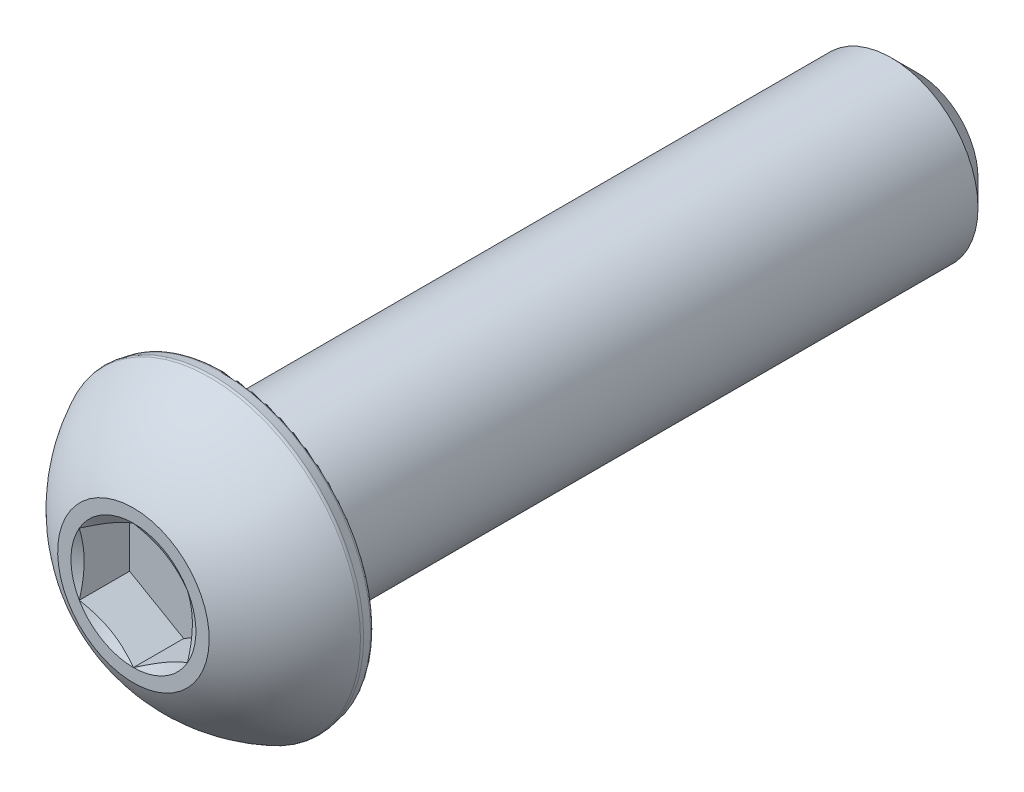
ISO-10303-21;
HEADER;
FILE_DESCRIPTION(('STEP AP214'),'2;1');
FILE_NAME('part.step','',(''),(''),'','','');
FILE_SCHEMA(('AUTOMOTIVE_DESIGN { 1 0 10303 214 1 1 1 1 }'));
ENDSEC;
DATA;
#1=APPLICATION_CONTEXT('core data for automotive mechanical design processes');
#2=APPLICATION_PROTOCOL_DEFINITION('international standard','automotive_design',2000,#1);
#3=PRODUCT_CONTEXT('',#1,'mechanical');
#4=PRODUCT('Part','Part','',(#3));
#5=PRODUCT_RELATED_PRODUCT_CATEGORY('part','',(#4));
#6=PRODUCT_DEFINITION_FORMATION('','',#4);
#7=PRODUCT_DEFINITION_CONTEXT('part definition',#1,'design');
#8=PRODUCT_DEFINITION('design','',#6,#7);
#9=PRODUCT_DEFINITION_SHAPE('','',#8);
#10=(LENGTH_UNIT() NAMED_UNIT(*) SI_UNIT(.MILLI.,.METRE.));
#11=(NAMED_UNIT(*) PLANE_ANGLE_UNIT() SI_UNIT($,.RADIAN.));
#12=(NAMED_UNIT(*) SI_UNIT($,.STERADIAN.) SOLID_ANGLE_UNIT());
#13=UNCERTAINTY_MEASURE_WITH_UNIT(LENGTH_MEASURE(1.E-05),#10,'distance_accuracy_value','');
#14=(GEOMETRIC_REPRESENTATION_CONTEXT(3) GLOBAL_UNCERTAINTY_ASSIGNED_CONTEXT((#13)) GLOBAL_UNIT_ASSIGNED_CONTEXT((#10,
#11,#12)) REPRESENTATION_CONTEXT('',''));
#15=CARTESIAN_POINT('',(0.,0.,0.));
#16=DIRECTION('',(0.,0.,1.));
#17=DIRECTION('',(1.,0.,0.));
#18=AXIS2_PLACEMENT_3D('',#15,#16,#17);
#19=CARTESIAN_POINT('',(0.,0.,14.3764));
#20=DIRECTION('',(0.,0.,-1.));
#21=DIRECTION('',(-1.,0.,0.));
#22=AXIS2_PLACEMENT_3D('',#19,#20,#21);
#23=PLANE('',#22);
#24=CARTESIAN_POINT('',(0.,0.,14.3764));
#25=DIRECTION('',(0.,0.,1.));
#26=DIRECTION('',(1.,0.,0.));
#27=AXIS2_PLACEMENT_3D('',#24,#25,#26);
#28=CIRCLE('',#27,2.29135888084633);
#29=CARTESIAN_POINT('',(-1.984375,1.14567944042316,14.3764));
#30=VERTEX_POINT('',#29);
#31=CARTESIAN_POINT('',(-1.984375,-1.14567944042316,14.3764));
#32=VERTEX_POINT('',#31);
#33=EDGE_CURVE('E87',#30,#32,#28,.T.);
#34=ORIENTED_EDGE('',*,*,#33,.F.);
#35=CARTESIAN_POINT('',(0.,2.29135888084633,14.3764));
#36=VERTEX_POINT('',#35);
#37=EDGE_CURVE('E96',#36,#30,#28,.T.);
#38=ORIENTED_EDGE('',*,*,#37,.F.);
#39=CARTESIAN_POINT('',(1.984375,1.14567944042316,14.3764));
#40=VERTEX_POINT('',#39);
#41=EDGE_CURVE('E47',#40,#36,#28,.T.);
#42=ORIENTED_EDGE('',*,*,#41,.F.);
#43=CARTESIAN_POINT('',(1.984375,-1.14567944042316,14.3764));
#44=VERTEX_POINT('',#43);
#45=EDGE_CURVE('E54',#44,#40,#28,.T.);
#46=ORIENTED_EDGE('',*,*,#45,.F.);
#47=CARTESIAN_POINT('',(0.,-2.29135888084633,14.3764));
#48=VERTEX_POINT('',#47);
#49=EDGE_CURVE('E129',#48,#44,#28,.T.);
#50=ORIENTED_EDGE('',*,*,#49,.F.);
#51=EDGE_CURVE('E97',#32,#48,#28,.T.);
#52=ORIENTED_EDGE('',*,*,#51,.F.);
#53=EDGE_LOOP('',(#34,#38,#42,#46,#50,#52));
#54=FACE_BOUND('',#53,.T.);
#55=CARTESIAN_POINT('',(0.,0.,14.3764));
#56=DIRECTION('',(0.,0.,1.));
#57=DIRECTION('',(1.,0.,0.));
#58=AXIS2_PLACEMENT_3D('',#55,#56,#57);
#59=CIRCLE('',#58,2.778125);
#60=CARTESIAN_POINT('',(0.,2.778125,14.3764));
#61=VERTEX_POINT('',#60);
#62=EDGE_CURVE('E108',#61,#61,#59,.T.);
#63=ORIENTED_EDGE('',*,*,#62,.T.);
#64=EDGE_LOOP('',(#63));
#65=FACE_BOUND('',#64,.T.);
#66=ADVANCED_FACE('F33',(#54,#65),#23,.F.);
#67=CARTESIAN_POINT('',(0.,0.,8.90156816343582));
#68=DIRECTION('',(0.,0.,1.));
#69=DIRECTION('',(0.,1.,0.));
#70=AXIS2_PLACEMENT_3D('',#67,#68,#69);
#71=SPHERICAL_SURFACE('',#70,6.13936170577054);
#72=CARTESIAN_POINT('',(0.,0.,11.5756987678523));
#73=DIRECTION('',(0.,0.,-1.));
#74=DIRECTION('',(-1.,0.,0.));
#75=AXIS2_PLACEMENT_3D('',#72,#73,#74);
#76=CIRCLE('',#75,5.52637201650459);
#77=CARTESIAN_POINT('',(0.,5.52637201650459,11.5756987678523));
#78=VERTEX_POINT('',#77);
#79=EDGE_CURVE('E107',#78,#78,#76,.F.);
#80=CARTESIAN_POINT('',(0.,5.52637201650459,11.5756987678523));
#81=CARTESIAN_POINT('',(0.,5.50825080177499,11.6131483071822));
#82=CARTESIAN_POINT('',(0.,5.48974881162674,11.6504135924003));
#83=CARTESIAN_POINT('',(0.,5.45199117255904,11.7245603788753));
#84=CARTESIAN_POINT('',(0.,5.4327355236396,11.7614418801323));
#85=CARTESIAN_POINT('',(0.,5.39347845909561,11.8348058229478));
#86=CARTESIAN_POINT('',(0.,5.37347704347106,11.8712882645063));
#87=CARTESIAN_POINT('',(0.,5.33273672924781,11.9438390196083));
#88=CARTESIAN_POINT('',(0.,5.3119978306491,11.9799073331517));
#89=CARTESIAN_POINT('',(0.,5.26979111662967,12.051614923668));
#90=CARTESIAN_POINT('',(0.,5.24832330120893,12.087254200641));
#91=CARTESIAN_POINT('',(0.,5.20466762693299,12.1580889898225));
#92=CARTESIAN_POINT('',(0.,5.18247976807778,12.1932845020311));
#93=CARTESIAN_POINT('',(0.,5.13739317629117,12.2632172160699));
#94=CARTESIAN_POINT('',(0.,5.11449444335977,12.2979544178999));
#95=CARTESIAN_POINT('',(0.,5.06799556699608,12.3669561551948));
#96=CARTESIAN_POINT('',(0.,5.04439542356379,12.4012206906595));
#97=CARTESIAN_POINT('',(0.,4.9965034795341,12.4692629345196));
#98=CARTESIAN_POINT('',(0.,4.9722116789367,12.503040642915));
#99=CARTESIAN_POINT('',(0.,4.92294645978839,12.5700952731416));
#100=CARTESIAN_POINT('',(0.,4.89797304123748,12.6033721949729));
#101=CARTESIAN_POINT('',(0.,4.84735490708144,12.6694114995354));
#102=CARTESIAN_POINT('',(0.,4.82171019147632,12.7021738822665));
#103=CARTESIAN_POINT('',(0.,4.76976006154396,12.7671705687402));
#104=CARTESIAN_POINT('',(0.,4.74345464721672,12.7994048724826));
#105=CARTESIAN_POINT('',(0.,4.69019399122224,12.8633320793321));
#106=CARTESIAN_POINT('',(0.,4.66323874955498,12.8950249824391));
#107=CARTESIAN_POINT('',(0.,4.6086895788204,12.9578562901185));
#108=CARTESIAN_POINT('',(0.,4.58109564975306,12.988994694691));
#109=CARTESIAN_POINT('',(0.,4.52528050811203,13.0507041365628));
#110=CARTESIAN_POINT('',(0.,4.49705929553834,13.0812751738621));
#111=CARTESIAN_POINT('',(0.,4.44000125001922,13.1418372469284));
#112=CARTESIAN_POINT('',(0.,4.41116441707379,13.1718282826952));
#113=CARTESIAN_POINT('',(0.,4.35288704836658,13.2312179581372));
#114=CARTESIAN_POINT('',(0.,4.32344651260481,13.2606165978123));
#115=CARTESIAN_POINT('',(0.,4.2639739053159,13.3188093313346));
#116=CARTESIAN_POINT('',(0.,4.23394183378876,13.3476034251818));
#117=CARTESIAN_POINT('',(0.,4.17329856648729,13.4045751671557));
#118=CARTESIAN_POINT('',(0.,4.14268737071296,13.4327528152824));
#119=CARTESIAN_POINT('',(0.,4.08089850577313,13.488480020685));
#120=CARTESIAN_POINT('',(0.,4.04972083660764,13.5160295779609));
#121=CARTESIAN_POINT('',(0.,3.98681190985103,13.5704892161058));
#122=CARTESIAN_POINT('',(0.,3.95508065225992,13.5973992969748));
#123=CARTESIAN_POINT('',(0.,3.89107766240224,13.65056886103));
#124=CARTESIAN_POINT('',(0.,3.85880593013567,13.6768283442161));
#125=CARTESIAN_POINT('',(0.,3.79373532804181,13.7286858605052));
#126=CARTESIAN_POINT('',(0.,3.76093645821454,13.7542838936082));
#127=CARTESIAN_POINT('',(0.,3.69482513596822,13.8048079306936));
#128=CARTESIAN_POINT('',(0.,3.66151268354918,13.829733934676));
#129=CARTESIAN_POINT('',(0.,3.59438796333499,13.8789036122083));
#130=CARTESIAN_POINT('',(0.,3.56057569553984,13.9031472857581));
#131=CARTESIAN_POINT('',(0.,3.49246531836684,13.9509422831338));
#132=CARTESIAN_POINT('',(0.,3.45816720898899,13.9744936069597));
#133=CARTESIAN_POINT('',(0.,3.3890993231695,14.0208941716134));
#134=CARTESIAN_POINT('',(0.,3.35432954672787,14.0437434124411));
#135=CARTESIAN_POINT('',(0.,3.28433269645534,14.088730368404));
#136=CARTESIAN_POINT('',(0.,3.24910562262445,14.1108680835392));
#137=CARTESIAN_POINT('',(0.,3.17820873538992,14.1544228378885));
#138=CARTESIAN_POINT('',(0.,3.14253892198628,14.1758398771027));
#139=CARTESIAN_POINT('',(0.,3.0707712995602,14.2179444331528));
#140=CARTESIAN_POINT('',(0.,3.03467349053775,14.2386319499888));
#141=CARTESIAN_POINT('',(0.,2.96206478589977,14.2792688941756));
#142=CARTESIAN_POINT('',(0.,2.92555389028424,14.2992183215265));
#143=CARTESIAN_POINT('',(0.,2.85213413627351,14.3383709073101));
#144=CARTESIAN_POINT('',(0.,2.81522527787832,14.3575740657429));
#145=CARTESIAN_POINT('',(0.,2.778125,14.3764));
#146=B_SPLINE_CURVE_WITH_KNOTS('',3,(#80,#81,#82,#83,#84,#85,#86,#87,#88,#89,#90,#91,#92,#93,
#94,#95,#96,#97,#98,#99,#100,#101,#102,#103,#104,#105,#106,#107,#108,#109,#110,#111,#112,#113,
#114,#115,#116,#117,#118,#119,#120,#121,#122,#123,#124,#125,#126,#127,#128,#129,#130,#131,#132,
#133,#134,#135,#136,#137,#138,#139,#140,#141,#142,#143,#144,#145),.UNSPECIFIED.,.F.,.F.,(4,2,2,
2,2,2,2,2,2,2,2,2,2,2,2,2,2,2,2,2,2,2,2,2,2,2,2,2,2,2,2,2,4),(0.,0.124808174209303,
0.249616348418608,0.374424522627913,0.499232696837218,0.624040871046522,0.748849045255826,
0.87365721946513,0.998465393674434,1.12327356788374,1.24808174209304,1.37288991630235,
1.49769809051165,1.62250626472096,1.74731443893026,1.87212261313957,1.99693078734887,
2.12173896155817,2.24654713576748,2.37135530997678,2.49616348418609,2.62097165839539,
2.7457798326047,2.870588006814,2.99539618102331,3.12020435523261,3.24501252944191,
3.36982070365122,3.49462887786052,3.61943705206983,3.74424522627913,3.86905340048844,
3.99386157469774),.UNSPECIFIED.);
#147=EDGE_CURVE('BSEAM202',#78,#61,#146,.T.);
#148=ORIENTED_EDGE('',*,*,#79,.T.);
#149=ORIENTED_EDGE('',*,*,#62,.F.);
#150=ORIENTED_EDGE('',*,*,#147,.T.);
#151=ORIENTED_EDGE('',*,*,#147,.F.);
#152=EDGE_LOOP('',(#148,#150,#149,#151));
#153=FACE_BOUND('',#152,.T.);
#154=ADVANCED_FACE('F202',(#153),#71,.T.);
#155=CARTESIAN_POINT('',(0.,0.,11.0236));
#156=DIRECTION('',(0.,0.,1.));
#157=DIRECTION('',(1.,0.,0.));
#158=AXIS2_PLACEMENT_3D('',#155,#156,#157);
#159=CONICAL_SURFACE('',#158,5.4612216348621,0.174532925199434);
#160=CARTESIAN_POINT('',(0.,0.,11.4735691915411));
#161=DIRECTION('',(0.,0.,-1.));
#162=DIRECTION('',(-1.,0.,0.));
#163=AXIS2_PLACEMENT_3D('',#160,#161,#162);
#164=CIRCLE('',#163,5.54056334381837);
#165=CARTESIAN_POINT('',(-5.54056334381837,0.,11.4735691915411));
#166=VERTEX_POINT('',#165);
#167=EDGE_CURVE('E41',#166,#166,#164,.T.);
#168=ORIENTED_EDGE('',*,*,#167,.T.);
#169=EDGE_LOOP('',(#168));
#170=FACE_BOUND('',#169,.T.);
#171=CARTESIAN_POINT('',(0.,0.,11.1621296194959));
#172=DIRECTION('',(0.,0.,-1.));
#173=DIRECTION('',(-1.,0.,0.));
#174=AXIS2_PLACEMENT_3D('',#171,#172,#173);
#175=CIRCLE('',#174,5.48564814440651);
#176=CARTESIAN_POINT('',(-5.48564814440651,0.,11.1621296194959));
#177=VERTEX_POINT('',#176);
#178=EDGE_CURVE('E224',#177,#177,#175,.F.);
#179=ORIENTED_EDGE('',*,*,#178,.T.);
#180=EDGE_LOOP('',(#179));
#181=FACE_BOUND('',#180,.T.);
#182=ADVANCED_FACE('F207',(#170,#181),#159,.T.);
#183=CARTESIAN_POINT('',(0.,5.4612216348621,11.0236));
#184=DIRECTION('',(0.,0.,1.));
#185=DIRECTION('',(1.,0.,0.));
#186=AXIS2_PLACEMENT_3D('',#183,#184,#185);
#187=PLANE('',#186);
#188=CARTESIAN_POINT('',(0.,0.,11.0236));
#189=DIRECTION('',(0.,0.,1.));
#190=DIRECTION('',(1.,0.,0.));
#191=AXIS2_PLACEMENT_3D('',#188,#189,#190);
#192=CIRCLE('',#191,5.32055497269154);
#193=CARTESIAN_POINT('',(5.32055497269154,0.,11.0236));
#194=VERTEX_POINT('',#193);
#195=EDGE_CURVE('E11',#194,#194,#192,.F.);
#196=ORIENTED_EDGE('',*,*,#195,.T.);
#197=EDGE_LOOP('',(#196));
#198=FACE_BOUND('',#197,.T.);
#199=CARTESIAN_POINT('',(0.,0.,11.0236));
#200=DIRECTION('',(0.,0.,1.));
#201=DIRECTION('',(1.,0.,0.));
#202=AXIS2_PLACEMENT_3D('',#199,#200,#201);
#203=CIRCLE('',#202,3.175);
#204=CARTESIAN_POINT('',(3.175,0.,11.0236));
#205=VERTEX_POINT('',#204);
#206=EDGE_CURVE('E289',#205,#205,#203,.T.);
#207=ORIENTED_EDGE('',*,*,#206,.T.);
#208=EDGE_LOOP('',(#207));
#209=FACE_BOUND('',#208,.T.);
#210=ADVANCED_FACE('F230',(#198,#209),#187,.F.);
#211=CARTESIAN_POINT('',(0.,0.,14.3764));
#212=DIRECTION('',(0.,0.,1.));
#213=DIRECTION('',(1.,0.,0.));
#214=AXIS2_PLACEMENT_3D('',#211,#212,#213);
#215=CYLINDRICAL_SURFACE('',#214,3.175);
#216=ORIENTED_EDGE('',*,*,#206,.F.);
#217=EDGE_LOOP('',(#216));
#218=FACE_BOUND('',#217,.T.);
#219=CARTESIAN_POINT('',(0.,0.,-13.4239));
#220=DIRECTION('',(0.,0.,1.));
#221=DIRECTION('',(1.,0.,0.));
#222=AXIS2_PLACEMENT_3D('',#219,#220,#221);
#223=CIRCLE('',#222,3.175);
#224=CARTESIAN_POINT('',(3.175,0.,-13.4239));
#225=VERTEX_POINT('',#224);
#226=EDGE_CURVE('E286',#225,#225,#223,.T.);
#227=ORIENTED_EDGE('',*,*,#226,.T.);
#228=EDGE_LOOP('',(#227));
#229=FACE_BOUND('',#228,.T.);
#230=ADVANCED_FACE('F236',(#218,#229),#215,.T.);
#231=CARTESIAN_POINT('',(0.,0.,-14.3764));
#232=DIRECTION('',(0.,0.,1.));
#233=DIRECTION('',(1.,0.,0.));
#234=AXIS2_PLACEMENT_3D('',#231,#232,#233);
#235=CONICAL_SURFACE('',#234,2.2225,0.785398163397444);
#236=ORIENTED_EDGE('',*,*,#226,.F.);
#237=EDGE_LOOP('',(#236));
#238=FACE_BOUND('',#237,.T.);
#239=CARTESIAN_POINT('',(0.,0.,-14.3764));
#240=DIRECTION('',(0.,0.,1.));
#241=DIRECTION('',(1.,0.,0.));
#242=AXIS2_PLACEMENT_3D('',#239,#240,#241);
#243=CIRCLE('',#242,2.2225);
#244=CARTESIAN_POINT('',(2.2225,0.,-14.3764));
#245=VERTEX_POINT('',#244);
#246=EDGE_CURVE('E274',#245,#245,#243,.T.);
#247=ORIENTED_EDGE('',*,*,#246,.T.);
#248=EDGE_LOOP('',(#247));
#249=FACE_BOUND('',#248,.T.);
#250=ADVANCED_FACE('F242',(#238,#249),#235,.T.);
#251=CARTESIAN_POINT('',(0.,0.,-14.3764));
#252=DIRECTION('',(0.,0.,1.));
#253=DIRECTION('',(1.,0.,0.));
#254=AXIS2_PLACEMENT_3D('',#251,#252,#253);
#255=PLANE('',#254);
#256=ORIENTED_EDGE('',*,*,#246,.F.);
#257=EDGE_LOOP('',(#256));
#258=FACE_BOUND('',#257,.T.);
#259=ADVANCED_FACE('F246',(#258),#255,.F.);
#260=CARTESIAN_POINT('',(0.,0.,14.3764));
#261=DIRECTION('',(0.,0.,1.));
#262=DIRECTION('',(1.,0.,0.));
#263=AXIS2_PLACEMENT_3D('',#260,#261,#262);
#264=CONICAL_SURFACE('',#263,2.29135888084633,1.0471975511966);
#265=ORIENTED_EDGE('',*,*,#51,.T.);
#266=CARTESIAN_POINT('',(-1.984575,-1.14556397036933,14.3764666717058));
#267=CARTESIAN_POINT('',(-1.89737036121932,-1.19591159204393,14.3473856822402));
#268=CARTESIAN_POINT('',(-1.809412980695,-1.24669380936686,14.320937208027));
#269=CARTESIAN_POINT('',(-1.63197502132768,-1.34913766297205,14.2747702712065));
#270=CARTESIAN_POINT('',(-1.54249128874368,-1.40080112006751,14.255068142249));
#271=CARTESIAN_POINT('',(-1.36463285198753,-1.50348773640632,14.2243977319315));
#272=CARTESIAN_POINT('',(-1.27628551969391,-1.55449509248823,14.2132253427202));
#273=CARTESIAN_POINT('',(-1.09917497188905,-1.65674991493968,14.1998857960544));
#274=CARTESIAN_POINT('',(-1.01041240048945,-1.70799700943121,14.1977075944601));
#275=CARTESIAN_POINT('',(-0.844542697135338,-1.80376192731311,14.2022295515083));
#276=CARTESIAN_POINT('',(-0.767410784334093,-1.84829405793202,14.2078194134559));
#277=CARTESIAN_POINT('',(-0.613649492810919,-1.93706818098387,14.225538933897));
#278=CARTESIAN_POINT('',(-0.537020646254476,-1.98130986617092,14.2376746503295));
#279=CARTESIAN_POINT('',(-0.382942111493217,-2.07026714969167,14.2680141588444));
#280=CARTESIAN_POINT('',(-0.305511932787317,-2.11497148421093,14.286346609291));
#281=CARTESIAN_POINT('',(-0.151806688756411,-2.20371324822803,14.3279545064002));
#282=CARTESIAN_POINT('',(-0.0755296529470674,-2.24775181538554,14.3512201712824));
#283=CARTESIAN_POINT('',(0.000200000000000533,-2.29147435090016,14.3764666717058));
#284=B_SPLINE_CURVE_WITH_KNOTS('',3,(#266,#267,#268,#269,#270,#271,#272,#273,#274,#275,#276,
#277,#278,#279,#280,#281,#282,#283),.UNSPECIFIED.,.F.,.F.,(4,2,2,2,2,2,2,2,4),(0.,
0.314555137114086,0.629866549668807,0.937373439505933,1.24450262309398,1.51196650590478,
1.77967834211415,2.05332989762155,2.32644383656793),.UNSPECIFIED.);
#285=EDGE_CURVE('E102',#32,#48,#284,.T.);
#286=ORIENTED_EDGE('',*,*,#285,.F.);
#287=EDGE_LOOP('',(#265,#286));
#288=FACE_BOUND('',#287,.T.);
#289=ADVANCED_FACE('F103',(#288),#264,.F.);
#290=ORIENTED_EDGE('',*,*,#49,.T.);
#291=CARTESIAN_POINT('',(-0.000199999999999445,-2.29147435090017,14.3764666717058));
#292=CARTESIAN_POINT('',(0.0870046387806769,-2.24112672922556,14.3473856822402));
#293=CARTESIAN_POINT('',(0.174962019304997,-2.19034451190263,14.320937208027));
#294=CARTESIAN_POINT('',(0.352399978672321,-2.08790065829744,14.2747702712065));
#295=CARTESIAN_POINT('',(0.44188371125632,-2.03623720120198,14.255068142249));
#296=CARTESIAN_POINT('',(0.619742148012469,-1.93355058486317,14.2243977319315));
#297=CARTESIAN_POINT('',(0.708089480306094,-1.88254322878126,14.2132253427202));
#298=CARTESIAN_POINT('',(0.88520002811095,-1.78028840632981,14.1998857960544));
#299=CARTESIAN_POINT('',(0.973962599510547,-1.72904131183829,14.1977075944601));
#300=CARTESIAN_POINT('',(1.13983230286466,-1.63327639395638,14.2022295515083));
#301=CARTESIAN_POINT('',(1.21696421566591,-1.58874426333747,14.2078194134559));
#302=CARTESIAN_POINT('',(1.37072550718908,-1.49997014028562,14.225538933897));
#303=CARTESIAN_POINT('',(1.44735435374552,-1.45572845509857,14.2376746503295));
#304=CARTESIAN_POINT('',(1.60143288850678,-1.36677117157782,14.2680141588444));
#305=CARTESIAN_POINT('',(1.67886306721268,-1.32206683705856,14.286346609291));
#306=CARTESIAN_POINT('',(1.83256831124359,-1.23332507304146,14.3279545064002));
#307=CARTESIAN_POINT('',(1.90884534705293,-1.18928650588395,14.3512201712824));
#308=CARTESIAN_POINT('',(1.984575,-1.14556397036933,14.3764666717058));
#309=B_SPLINE_CURVE_WITH_KNOTS('',3,(#291,#292,#293,#294,#295,#296,#297,#298,#299,#300,#301,
#302,#303,#304,#305,#306,#307,#308),.UNSPECIFIED.,.F.,.F.,(4,2,2,2,2,2,2,2,4),(0.,
0.314555137114086,0.629866549668807,0.937373439505933,1.24450262309398,1.51196650590478,
1.77967834211415,2.05332989762155,2.32644383656793),.UNSPECIFIED.);
#310=EDGE_CURVE('E131',#48,#44,#309,.T.);
#311=ORIENTED_EDGE('',*,*,#310,.F.);
#312=EDGE_LOOP('',(#290,#311));
#313=FACE_BOUND('',#312,.T.);
#314=ADVANCED_FACE('F315',(#313),#264,.F.);
#315=ORIENTED_EDGE('',*,*,#45,.T.);
#316=CARTESIAN_POINT('',(1.984375,-2.96692860034506,15.1142606510924));
#317=CARTESIAN_POINT('',(1.984375,-2.88123645369666,15.0731488017753));
#318=CARTESIAN_POINT('',(1.984375,-2.79533554929687,15.0324639729561));
#319=CARTESIAN_POINT('',(1.984375,-2.62300496253372,14.9521905979452));
#320=CARTESIAN_POINT('',(1.984375,-2.53657518838115,14.9126022490471));
#321=CARTESIAN_POINT('',(1.984375,-2.36258003650985,14.8345429144296));
#322=CARTESIAN_POINT('',(1.984375,-2.27501095051754,14.7960801633989));
#323=CARTESIAN_POINT('',(1.984375,-2.09913795632987,14.7208794270975));
#324=CARTESIAN_POINT('',(1.984375,-2.01083408662377,14.6841413521464));
#325=CARTESIAN_POINT('',(1.984375,-1.83102497893539,14.611913729355));
#326=CARTESIAN_POINT('',(1.984375,-1.73949640320228,14.5764819390739));
#327=CARTESIAN_POINT('',(1.984375,-1.55533214713673,14.5085641835568));
#328=CARTESIAN_POINT('',(1.984375,-1.46269633980311,14.4760785599926));
#329=CARTESIAN_POINT('',(1.984375,-1.27638419434465,14.4149821363592));
#330=CARTESIAN_POINT('',(1.984375,-1.18271082678456,14.3863623752382));
#331=CARTESIAN_POINT('',(1.984375,-0.994021652382585,14.3339763688606));
#332=CARTESIAN_POINT('',(1.984375,-0.89900618522973,14.3102089181985));
#333=CARTESIAN_POINT('',(1.984375,-0.707830512458418,14.2687947393806));
#334=CARTESIAN_POINT('',(1.984375,-0.611673084373237,14.251135440066));
#335=CARTESIAN_POINT('',(1.984375,-0.41828309211367,14.2230930965335));
#336=CARTESIAN_POINT('',(1.984375,-0.321050601045249,14.2127095606059));
#337=CARTESIAN_POINT('',(1.984375,-0.127210752774482,14.2001852009906));
#338=CARTESIAN_POINT('',(1.984375,-0.030609863978122,14.1979471073686));
#339=CARTESIAN_POINT('',(1.984375,0.162431915887107,14.2016420470322));
#340=CARTESIAN_POINT('',(1.984375,0.258872796678699,14.2075755862751));
#341=CARTESIAN_POINT('',(1.984375,0.496826477184735,14.2317755736915));
#342=CARTESIAN_POINT('',(1.984375,0.637878211825128,14.2545772202142));
#343=CARTESIAN_POINT('',(1.984375,0.917238703702529,14.3133760242614));
#344=CARTESIAN_POINT('',(1.984375,1.05554394232965,14.3493890855425));
#345=CARTESIAN_POINT('',(1.984375,1.26239464896717,14.4109082078903));
#346=CARTESIAN_POINT('',(1.984375,1.33200934564274,14.4329514264146));
#347=CARTESIAN_POINT('',(1.984375,1.47051409380588,14.4790769862575));
#348=CARTESIAN_POINT('',(1.984375,1.53940456776433,14.5031580550061));
#349=CARTESIAN_POINT('',(1.984375,1.67655293465251,14.5530095886895));
#350=CARTESIAN_POINT('',(1.984375,1.74481093998432,14.5787797466023));
#351=CARTESIAN_POINT('',(1.984375,1.88078910071683,14.6317307126816));
#352=CARTESIAN_POINT('',(1.984375,1.94850916300286,14.658911759183));
#353=CARTESIAN_POINT('',(1.984375,2.12136731788458,14.7300336238359));
#354=CARTESIAN_POINT('',(1.984375,2.22615977384556,14.7748135967013));
#355=CARTESIAN_POINT('',(1.984375,2.43479837304527,14.8665321956825));
#356=CARTESIAN_POINT('',(1.984375,2.5386444446916,14.9134709835113));
#357=CARTESIAN_POINT('',(1.984375,2.84907841644385,15.0567645613235));
#358=CARTESIAN_POINT('',(1.984375,3.05452739791262,15.1555818752643));
#359=CARTESIAN_POINT('',(1.984375,3.46367014223902,15.3573608857248));
#360=CARTESIAN_POINT('',(1.984375,3.66736143684958,15.460327527753));
#361=CARTESIAN_POINT('',(1.984375,4.07334844866211,15.6689084165548));
#362=CARTESIAN_POINT('',(1.984375,4.27564433912763,15.7745223267935));
#363=CARTESIAN_POINT('',(1.984375,4.66022184962415,15.9775193368616));
#364=CARTESIAN_POINT('',(1.984375,4.84259034249048,16.0747384272925));
#365=CARTESIAN_POINT('',(1.984375,5.20674070245669,16.2702843204883));
#366=CARTESIAN_POINT('',(1.984375,5.38852254752481,16.3686111642466));
#367=CARTESIAN_POINT('',(1.984375,5.75117247931181,16.565843617507));
#368=CARTESIAN_POINT('',(1.984375,5.93204171415673,16.6647471187779));
#369=CARTESIAN_POINT('',(1.984375,6.29341450955436,16.8631978398903));
#370=CARTESIAN_POINT('',(1.984375,6.47391808874828,16.9627450257738));
#371=CARTESIAN_POINT('',(1.984375,6.6542902961452,17.0625282522634));
#372=B_SPLINE_CURVE_WITH_KNOTS('',3,(#316,#317,#318,#319,#320,#321,#322,#323,#324,#325,#326,
#327,#328,#329,#330,#331,#332,#333,#334,#335,#336,#337,#338,#339,#340,#341,#342,#343,#344,#345,
#346,#347,#348,#349,#350,#351,#352,#353,#354,#355,#356,#357,#358,#359,#360,#361,#362,#363,#364,
#365,#366,#367,#368,#369,#370,#371),.UNSPECIFIED.,.F.,.F.,(4,2,2,2,2,2,2,2,2,2,2,2,2,2,2,2,2,2,
2,2,2,2,2,2,2,2,2,4),(0.,0.285135519832373,0.570322016122787,0.857238463819792,1.14413997577449,
1.43854271801315,1.7329795590899,2.02672173491208,2.32039085060263,2.61345191984504,
2.90649318156653,3.19602335108128,3.48557144803805,3.91334047285798,4.34162614021154,
4.56066589824458,4.77956986852721,4.99843415889189,5.21733554208811,5.55917796423187,
5.90104603503021,6.58489509249957,7.26958483186157,7.95418796687477,8.57417425374278,
9.1941835596094,9.81261585701217,10.431015790458),.UNSPECIFIED.);
#373=EDGE_CURVE('E140',#44,#40,#372,.T.);
#374=ORIENTED_EDGE('',*,*,#373,.F.);
#375=EDGE_LOOP('',(#315,#374));
#376=FACE_BOUND('',#375,.T.);
#377=ADVANCED_FACE('F311',(#376),#264,.F.);
#378=ORIENTED_EDGE('',*,*,#41,.T.);
#379=CARTESIAN_POINT('',(1.984575,1.14556397036933,14.3764666717058));
#380=CARTESIAN_POINT('',(1.89737036121932,1.19591159204393,14.3473856822402));
#381=CARTESIAN_POINT('',(1.809412980695,1.24669380936686,14.320937208027));
#382=CARTESIAN_POINT('',(1.63197502132768,1.34913766297205,14.2747702712065));
#383=CARTESIAN_POINT('',(1.54249128874368,1.40080112006751,14.255068142249));
#384=CARTESIAN_POINT('',(1.36463285198753,1.50348773640632,14.2243977319315));
#385=CARTESIAN_POINT('',(1.27628551969391,1.55449509248823,14.2132253427202));
#386=CARTESIAN_POINT('',(1.09917497188905,1.65674991493969,14.1998857960544));
#387=CARTESIAN_POINT('',(1.01041240048945,1.70799700943121,14.1977075944601));
#388=CARTESIAN_POINT('',(0.844542697135338,1.80376192731311,14.2022295515083));
#389=CARTESIAN_POINT('',(0.767410784334093,1.84829405793202,14.2078194134559));
#390=CARTESIAN_POINT('',(0.613649492810919,1.93706818098387,14.225538933897));
#391=CARTESIAN_POINT('',(0.537020646254476,1.98130986617092,14.2376746503295));
#392=CARTESIAN_POINT('',(0.382942111493216,2.07026714969167,14.2680141588444));
#393=CARTESIAN_POINT('',(0.305511932787317,2.11497148421093,14.286346609291));
#394=CARTESIAN_POINT('',(0.151806688756411,2.20371324822803,14.3279545064002));
#395=CARTESIAN_POINT('',(0.0755296529470673,2.24775181538554,14.3512201712824));
#396=CARTESIAN_POINT('',(-0.000200000000000831,2.29147435090017,14.3764666717058));
#397=B_SPLINE_CURVE_WITH_KNOTS('',3,(#379,#380,#381,#382,#383,#384,#385,#386,#387,#388,#389,
#390,#391,#392,#393,#394,#395,#396),.UNSPECIFIED.,.F.,.F.,(4,2,2,2,2,2,2,2,4),(0.,
0.314555137114086,0.629866549668807,0.937373439505933,1.24450262309398,1.51196650590478,
1.77967834211415,2.05332989762155,2.32644383656793),.UNSPECIFIED.);
#398=EDGE_CURVE('E167',#40,#36,#397,.T.);
#399=ORIENTED_EDGE('',*,*,#398,.F.);
#400=EDGE_LOOP('',(#378,#399));
#401=FACE_BOUND('',#400,.T.);
#402=ADVANCED_FACE('F307',(#401),#264,.F.);
#403=ORIENTED_EDGE('',*,*,#37,.T.);
#404=CARTESIAN_POINT('',(0.000199999999999225,2.29147435090017,14.3764666717058));
#405=CARTESIAN_POINT('',(-0.0870046387806773,2.24112672922556,14.3473856822402));
#406=CARTESIAN_POINT('',(-0.174962019304997,2.19034451190263,14.320937208027));
#407=CARTESIAN_POINT('',(-0.352399978672321,2.08790065829745,14.2747702712065));
#408=CARTESIAN_POINT('',(-0.44188371125632,2.03623720120198,14.255068142249));
#409=CARTESIAN_POINT('',(-0.619742148012469,1.93355058486317,14.2243977319315));
#410=CARTESIAN_POINT('',(-0.708089480306094,1.88254322878126,14.2132253427202));
#411=CARTESIAN_POINT('',(-0.885200028110951,1.78028840632981,14.1998857960544));
#412=CARTESIAN_POINT('',(-0.973962599510548,1.72904131183829,14.1977075944601));
#413=CARTESIAN_POINT('',(-1.13983230286466,1.63327639395638,14.2022295515083));
#414=CARTESIAN_POINT('',(-1.21696421566591,1.58874426333747,14.2078194134559));
#415=CARTESIAN_POINT('',(-1.37072550718908,1.49997014028563,14.225538933897));
#416=CARTESIAN_POINT('',(-1.44735435374553,1.45572845509857,14.2376746503295));
#417=CARTESIAN_POINT('',(-1.60143288850678,1.36677117157782,14.2680141588444));
#418=CARTESIAN_POINT('',(-1.67886306721268,1.32206683705856,14.286346609291));
#419=CARTESIAN_POINT('',(-1.83256831124359,1.23332507304146,14.3279545064002));
#420=CARTESIAN_POINT('',(-1.90884534705293,1.18928650588395,14.3512201712824));
#421=CARTESIAN_POINT('',(-1.984575,1.14556397036933,14.3764666717058));
#422=B_SPLINE_CURVE_WITH_KNOTS('',3,(#404,#405,#406,#407,#408,#409,#410,#411,#412,#413,#414,
#415,#416,#417,#418,#419,#420,#421),.UNSPECIFIED.,.F.,.F.,(4,2,2,2,2,2,2,2,4),(0.,
0.314555137114086,0.629866549668807,0.937373439505933,1.24450262309398,1.51196650590478,
1.77967834211415,2.05332989762155,2.32644383656793),.UNSPECIFIED.);
#423=EDGE_CURVE('E118',#36,#30,#422,.T.);
#424=ORIENTED_EDGE('',*,*,#423,.F.);
#425=EDGE_LOOP('',(#403,#424));
#426=FACE_BOUND('',#425,.T.);
#427=ADVANCED_FACE('F154',(#426),#264,.F.);
#428=ORIENTED_EDGE('',*,*,#33,.T.);
#429=CARTESIAN_POINT('',(-1.984375,-2.96692860034507,15.1142606510924));
#430=CARTESIAN_POINT('',(-1.984375,-2.88123645369667,15.0731488017753));
#431=CARTESIAN_POINT('',(-1.984375,-2.79533554929687,15.0324639729561));
#432=CARTESIAN_POINT('',(-1.984375,-2.62300496253372,14.9521905979452));
#433=CARTESIAN_POINT('',(-1.984375,-2.53657518838115,14.9126022490471));
#434=CARTESIAN_POINT('',(-1.984375,-2.36258003650985,14.8345429144296));
#435=CARTESIAN_POINT('',(-1.984375,-2.27501095051754,14.7960801633989));
#436=CARTESIAN_POINT('',(-1.984375,-2.09913795632987,14.7208794270975));
#437=CARTESIAN_POINT('',(-1.984375,-2.01083408662377,14.6841413521464));
#438=CARTESIAN_POINT('',(-1.984375,-1.83102497893539,14.611913729355));
#439=CARTESIAN_POINT('',(-1.984375,-1.73949640320228,14.5764819390739));
#440=CARTESIAN_POINT('',(-1.984375,-1.55533214713673,14.5085641835568));
#441=CARTESIAN_POINT('',(-1.984375,-1.46269633980311,14.4760785599926));
#442=CARTESIAN_POINT('',(-1.984375,-1.27638419434465,14.4149821363592));
#443=CARTESIAN_POINT('',(-1.984375,-1.18271082678456,14.3863623752382));
#444=CARTESIAN_POINT('',(-1.984375,-0.994021652382587,14.3339763688606));
#445=CARTESIAN_POINT('',(-1.984375,-0.899006185229732,14.3102089181985));
#446=CARTESIAN_POINT('',(-1.984375,-0.707830512458421,14.2687947393806));
#447=CARTESIAN_POINT('',(-1.984375,-0.61167308437324,14.251135440066));
#448=CARTESIAN_POINT('',(-1.984375,-0.418283092113672,14.2230930965335));
#449=CARTESIAN_POINT('',(-1.984375,-0.321050601045251,14.2127095606059));
#450=CARTESIAN_POINT('',(-1.984375,-0.127210752774483,14.2001852009906));
#451=CARTESIAN_POINT('',(-1.984375,-0.0306098639781238,14.1979471073686));
#452=CARTESIAN_POINT('',(-1.984375,0.162431915887106,14.2016420470322));
#453=CARTESIAN_POINT('',(-1.984375,0.258872796678698,14.2075755862751));
#454=CARTESIAN_POINT('',(-1.984375,0.496826477184734,14.2317755736915));
#455=CARTESIAN_POINT('',(-1.984375,0.637878211825127,14.2545772202142));
#456=CARTESIAN_POINT('',(-1.984375,0.917238703702528,14.3133760242614));
#457=CARTESIAN_POINT('',(-1.984375,1.05554394232965,14.3493890855425));
#458=CARTESIAN_POINT('',(-1.984375,1.26239464896717,14.4109082078903));
#459=CARTESIAN_POINT('',(-1.984375,1.33200934564274,14.4329514264146));
#460=CARTESIAN_POINT('',(-1.984375,1.47051409380588,14.4790769862575));
#461=CARTESIAN_POINT('',(-1.984375,1.53940456776433,14.5031580550061));
#462=CARTESIAN_POINT('',(-1.984375,1.67655293465251,14.5530095886895));
#463=CARTESIAN_POINT('',(-1.984375,1.74481093998432,14.5787797466023));
#464=CARTESIAN_POINT('',(-1.984375,1.88078910071683,14.6317307126816));
#465=CARTESIAN_POINT('',(-1.984375,1.94850916300286,14.658911759183));
#466=CARTESIAN_POINT('',(-1.984375,2.12136731788458,14.7300336238359));
#467=CARTESIAN_POINT('',(-1.984375,2.22615977384556,14.7748135967013));
#468=CARTESIAN_POINT('',(-1.984375,2.43479837304527,14.8665321956825));
#469=CARTESIAN_POINT('',(-1.984375,2.5386444446916,14.9134709835113));
#470=CARTESIAN_POINT('',(-1.984375,2.84907841644385,15.0567645613235));
#471=CARTESIAN_POINT('',(-1.984375,3.05452739791262,15.1555818752643));
#472=CARTESIAN_POINT('',(-1.984375,3.46367014223902,15.3573608857248));
#473=CARTESIAN_POINT('',(-1.984375,3.66736143684958,15.460327527753));
#474=CARTESIAN_POINT('',(-1.984375,4.07334844866211,15.6689084165548));
#475=CARTESIAN_POINT('',(-1.984375,4.27564433912762,15.7745223267935));
#476=CARTESIAN_POINT('',(-1.984375,4.66022184962415,15.9775193368616));
#477=CARTESIAN_POINT('',(-1.984375,4.84259034249047,16.0747384272925));
#478=CARTESIAN_POINT('',(-1.984375,5.20674070245669,16.2702843204883));
#479=CARTESIAN_POINT('',(-1.984375,5.38852254752481,16.3686111642466));
#480=CARTESIAN_POINT('',(-1.984375,5.75117247931181,16.565843617507));
#481=CARTESIAN_POINT('',(-1.984375,5.93204171415673,16.6647471187779));
#482=CARTESIAN_POINT('',(-1.984375,6.29341450955435,16.8631978398903));
#483=CARTESIAN_POINT('',(-1.984375,6.47391808874828,16.9627450257738));
#484=CARTESIAN_POINT('',(-1.984375,6.6542902961452,17.0625282522634));
#485=B_SPLINE_CURVE_WITH_KNOTS('',3,(#429,#430,#431,#432,#433,#434,#435,#436,#437,#438,#439,
#440,#441,#442,#443,#444,#445,#446,#447,#448,#449,#450,#451,#452,#453,#454,#455,#456,#457,#458,
#459,#460,#461,#462,#463,#464,#465,#466,#467,#468,#469,#470,#471,#472,#473,#474,#475,#476,#477,
#478,#479,#480,#481,#482,#483,#484),.UNSPECIFIED.,.F.,.F.,(4,2,2,2,2,2,2,2,2,2,2,2,2,2,2,2,2,2,
2,2,2,2,2,2,2,2,2,4),(0.,0.285135519832373,0.570322016122787,0.857238463819792,1.14413997577449,
1.43854271801315,1.7329795590899,2.02672173491208,2.32039085060263,2.61345191984504,
2.90649318156653,3.19602335108128,3.48557144803805,3.91334047285799,4.34162614021154,
4.56066589824458,4.77956986852721,4.9984341588919,5.21733554208812,5.55917796423187,
5.90104603503021,6.58489509249957,7.26958483186157,7.95418796687477,8.57417425374278,
9.1941835596094,9.81261585701217,10.431015790458),.UNSPECIFIED.);
#486=EDGE_CURVE('E91',#30,#32,#485,.F.);
#487=ORIENTED_EDGE('',*,*,#486,.F.);
#488=EDGE_LOOP('',(#428,#487));
#489=FACE_BOUND('',#488,.T.);
#490=ADVANCED_FACE('F89',(#489),#264,.F.);
#491=CARTESIAN_POINT('',(0.,0.,12.53236));
#492=DIRECTION('',(0.,0.,1.));
#493=DIRECTION('',(1.,0.,0.));
#494=AXIS2_PLACEMENT_3D('',#491,#492,#493);
#495=PLANE('',#494);
#496=DIRECTION('',(0.,-1.,0.));
#497=VECTOR('',#496,1.);
#498=CARTESIAN_POINT('',(-1.984375,1.14567944042316,12.53236));
#499=LINE('',#498,#497);
#500=CARTESIAN_POINT('',(-1.984375,1.14567944042316,12.53236));
#501=VERTEX_POINT('',#500);
#502=CARTESIAN_POINT('',(-1.984375,-1.14567944042316,12.53236));
#503=VERTEX_POINT('',#502);
#504=EDGE_CURVE('E117',#501,#503,#499,.T.);
#505=ORIENTED_EDGE('',*,*,#504,.T.);
#506=DIRECTION('',(0.866025403784439,-0.5,0.));
#507=VECTOR('',#506,1.);
#508=CARTESIAN_POINT('',(-1.984375,-1.14567944042316,12.53236));
#509=LINE('',#508,#507);
#510=CARTESIAN_POINT('',(0.,-2.29135888084633,12.53236));
#511=VERTEX_POINT('',#510);
#512=EDGE_CURVE('E122',#503,#511,#509,.T.);
#513=ORIENTED_EDGE('',*,*,#512,.T.);
#514=DIRECTION('',(0.866025403784438,0.5,0.));
#515=VECTOR('',#514,1.);
#516=CARTESIAN_POINT('',(0.,-2.29135888084633,12.53236));
#517=LINE('',#516,#515);
#518=CARTESIAN_POINT('',(1.984375,-1.14567944042316,12.53236));
#519=VERTEX_POINT('',#518);
#520=EDGE_CURVE('E263',#511,#519,#517,.T.);
#521=ORIENTED_EDGE('',*,*,#520,.T.);
#522=DIRECTION('',(0.,1.,0.));
#523=VECTOR('',#522,1.);
#524=CARTESIAN_POINT('',(1.984375,-1.14567944042316,12.53236));
#525=LINE('',#524,#523);
#526=CARTESIAN_POINT('',(1.984375,1.14567944042316,12.53236));
#527=VERTEX_POINT('',#526);
#528=EDGE_CURVE('E267',#519,#527,#525,.T.);
#529=ORIENTED_EDGE('',*,*,#528,.T.);
#530=DIRECTION('',(-0.866025403784439,0.5,0.));
#531=VECTOR('',#530,1.);
#532=CARTESIAN_POINT('',(1.984375,1.14567944042316,12.53236));
#533=LINE('',#532,#531);
#534=CARTESIAN_POINT('',(0.,2.29135888084633,12.53236));
#535=VERTEX_POINT('',#534);
#536=EDGE_CURVE('E270',#527,#535,#533,.T.);
#537=ORIENTED_EDGE('',*,*,#536,.T.);
#538=DIRECTION('',(-0.866025403784438,-0.5,0.));
#539=VECTOR('',#538,1.);
#540=CARTESIAN_POINT('',(0.,2.29135888084633,12.53236));
#541=LINE('',#540,#539);
#542=EDGE_CURVE('E125',#535,#501,#541,.T.);
#543=ORIENTED_EDGE('',*,*,#542,.T.);
#544=EDGE_LOOP('',(#505,#513,#521,#529,#537,#543));
#545=FACE_BOUND('',#544,.T.);
#546=ADVANCED_FACE('F153',(#545),#495,.T.);
#547=CARTESIAN_POINT('',(-1.984375,-1.14567944042316,12.53236));
#548=DIRECTION('',(-0.5,-0.866025403784439,0.));
#549=DIRECTION('',(0.866025403784439,-0.5,0.));
#550=AXIS2_PLACEMENT_3D('',#547,#548,#549);
#551=PLANE('',#550);
#552=DIRECTION('',(0.,0.,1.));
#553=VECTOR('',#552,1.);
#554=CARTESIAN_POINT('',(-1.984375,-1.14567944042316,12.53236));
#555=LINE('',#554,#553);
#556=EDGE_CURVE('E113',#503,#32,#555,.T.);
#557=ORIENTED_EDGE('',*,*,#556,.T.);
#558=ORIENTED_EDGE('',*,*,#285,.T.);
#559=DIRECTION('',(0.,0.,1.));
#560=VECTOR('',#559,1.);
#561=CARTESIAN_POINT('',(0.,-2.29135888084633,12.53236));
#562=LINE('',#561,#560);
#563=EDGE_CURVE('E124',#511,#48,#562,.T.);
#564=ORIENTED_EDGE('',*,*,#563,.F.);
#565=ORIENTED_EDGE('',*,*,#512,.F.);
#566=EDGE_LOOP('',(#557,#558,#564,#565));
#567=FACE_BOUND('',#566,.T.);
#568=ADVANCED_FACE('F120',(#567),#551,.F.);
#569=CARTESIAN_POINT('',(0.,-2.29135888084633,12.53236));
#570=DIRECTION('',(0.5,-0.866025403784439,0.));
#571=DIRECTION('',(0.866025403784439,0.5,0.));
#572=AXIS2_PLACEMENT_3D('',#569,#570,#571);
#573=PLANE('',#572);
#574=ORIENTED_EDGE('',*,*,#563,.T.);
#575=ORIENTED_EDGE('',*,*,#310,.T.);
#576=DIRECTION('',(0.,0.,1.));
#577=VECTOR('',#576,1.);
#578=CARTESIAN_POINT('',(1.984375,-1.14567944042316,12.53236));
#579=LINE('',#578,#577);
#580=EDGE_CURVE('E281',#519,#44,#579,.T.);
#581=ORIENTED_EDGE('',*,*,#580,.F.);
#582=ORIENTED_EDGE('',*,*,#520,.F.);
#583=EDGE_LOOP('',(#574,#575,#581,#582));
#584=FACE_BOUND('',#583,.T.);
#585=ADVANCED_FACE('F147',(#584),#573,.F.);
#586=CARTESIAN_POINT('',(1.984375,-1.14567944042316,12.53236));
#587=DIRECTION('',(1.,0.,0.));
#588=DIRECTION('',(0.,0.,-1.));
#589=AXIS2_PLACEMENT_3D('',#586,#587,#588);
#590=PLANE('',#589);
#591=ORIENTED_EDGE('',*,*,#580,.T.);
#592=ORIENTED_EDGE('',*,*,#373,.T.);
#593=DIRECTION('',(0.,0.,1.));
#594=VECTOR('',#593,1.);
#595=CARTESIAN_POINT('',(1.984375,1.14567944042316,12.53236));
#596=LINE('',#595,#594);
#597=EDGE_CURVE('E278',#527,#40,#596,.T.);
#598=ORIENTED_EDGE('',*,*,#597,.F.);
#599=ORIENTED_EDGE('',*,*,#528,.F.);
#600=EDGE_LOOP('',(#591,#592,#598,#599));
#601=FACE_BOUND('',#600,.T.);
#602=ADVANCED_FACE('F191',(#601),#590,.F.);
#603=CARTESIAN_POINT('',(1.984375,1.14567944042316,12.53236));
#604=DIRECTION('',(0.5,0.866025403784439,0.));
#605=DIRECTION('',(-0.866025403784439,0.5,0.));
#606=AXIS2_PLACEMENT_3D('',#603,#604,#605);
#607=PLANE('',#606);
#608=ORIENTED_EDGE('',*,*,#597,.T.);
#609=ORIENTED_EDGE('',*,*,#398,.T.);
#610=DIRECTION('',(0.,0.,1.));
#611=VECTOR('',#610,1.);
#612=CARTESIAN_POINT('',(0.,2.29135888084633,12.53236));
#613=LINE('',#612,#611);
#614=EDGE_CURVE('E275',#535,#36,#613,.T.);
#615=ORIENTED_EDGE('',*,*,#614,.F.);
#616=ORIENTED_EDGE('',*,*,#536,.F.);
#617=EDGE_LOOP('',(#608,#609,#615,#616));
#618=FACE_BOUND('',#617,.T.);
#619=ADVANCED_FACE('F187',(#618),#607,.F.);
#620=CARTESIAN_POINT('',(0.,2.29135888084633,12.53236));
#621=DIRECTION('',(-0.5,0.866025403784438,0.));
#622=DIRECTION('',(-0.866025403784439,-0.5,0.));
#623=AXIS2_PLACEMENT_3D('',#620,#621,#622);
#624=PLANE('',#623);
#625=ORIENTED_EDGE('',*,*,#614,.T.);
#626=ORIENTED_EDGE('',*,*,#423,.T.);
#627=DIRECTION('',(0.,0.,1.));
#628=VECTOR('',#627,1.);
#629=CARTESIAN_POINT('',(-1.984375,1.14567944042316,12.53236));
#630=LINE('',#629,#628);
#631=EDGE_CURVE('E115',#501,#30,#630,.T.);
#632=ORIENTED_EDGE('',*,*,#631,.F.);
#633=ORIENTED_EDGE('',*,*,#542,.F.);
#634=EDGE_LOOP('',(#625,#626,#632,#633));
#635=FACE_BOUND('',#634,.T.);
#636=ADVANCED_FACE('F184',(#635),#624,.F.);
#637=CARTESIAN_POINT('',(-1.984375,1.14567944042316,12.53236));
#638=DIRECTION('',(-1.,0.,0.));
#639=DIRECTION('',(0.,-1.,0.));
#640=AXIS2_PLACEMENT_3D('',#637,#638,#639);
#641=PLANE('',#640);
#642=ORIENTED_EDGE('',*,*,#631,.T.);
#643=ORIENTED_EDGE('',*,*,#486,.T.);
#644=ORIENTED_EDGE('',*,*,#556,.F.);
#645=ORIENTED_EDGE('',*,*,#504,.F.);
#646=EDGE_LOOP('',(#642,#643,#644,#645));
#647=FACE_BOUND('',#646,.T.);
#648=ADVANCED_FACE('F111',(#647),#641,.F.);
#649=CARTESIAN_POINT('',(0.,0.,11.5026795720452));
#650=DIRECTION('',(0.,0.,-1.));
#651=DIRECTION('',(-1.,0.,0.));
#652=AXIS2_PLACEMENT_3D('',#649,#650,#651);
#653=TOROIDAL_SURFACE('',#652,5.3754701721034,0.16764);
#654=ORIENTED_EDGE('',*,*,#167,.F.);
#655=EDGE_LOOP('',(#654));
#656=FACE_BOUND('',#655,.T.);
#657=ORIENTED_EDGE('',*,*,#79,.F.);
#658=EDGE_LOOP('',(#657));
#659=FACE_BOUND('',#658,.T.);
#660=ADVANCED_FACE('F211',(#656,#659),#653,.T.);
#661=CARTESIAN_POINT('',(0.,0.,11.19124));
#662=DIRECTION('',(0.,0.,1.));
#663=DIRECTION('',(1.,0.,0.));
#664=AXIS2_PLACEMENT_3D('',#661,#662,#663);
#665=TOROIDAL_SURFACE('',#664,5.32055497269154,0.16764);
#666=ORIENTED_EDGE('',*,*,#195,.F.);
#667=EDGE_LOOP('',(#666));
#668=FACE_BOUND('',#667,.T.);
#669=ORIENTED_EDGE('',*,*,#178,.F.);
#670=EDGE_LOOP('',(#669));
#671=FACE_BOUND('',#670,.T.);
#672=ADVANCED_FACE('F35',(#668,#671),#665,.T.);
#673=CLOSED_SHELL('',(#66,#154,#182,#210,#230,#250,#259,#289,#314,#377,#402,#427,#490,#546,#568,
#585,#602,#619,#636,#648,#660,#672));
#674=MANIFOLD_SOLID_BREP('B2',#673);
#675=ADVANCED_BREP_SHAPE_REPRESENTATION('',(#18,#674),#14);
#676=SHAPE_DEFINITION_REPRESENTATION(#9,#675);
ENDSEC;
END-ISO-10303-21;
